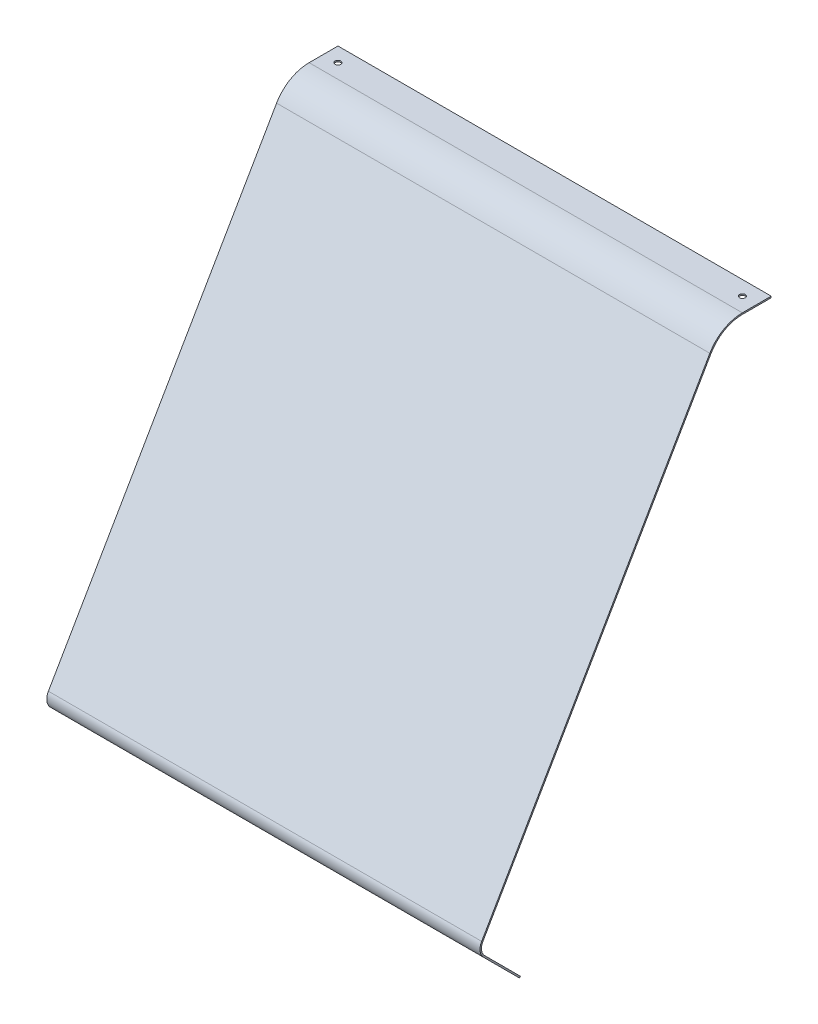
ISO-10303-21;
HEADER;
FILE_DESCRIPTION(('STEP AP214'),'2;1');
FILE_NAME('part.step','',(''),(''),'','','');
FILE_SCHEMA(('AUTOMOTIVE_DESIGN { 1 0 10303 214 1 1 1 1 }'));
ENDSEC;
DATA;
#1=APPLICATION_CONTEXT('core data for automotive mechanical design processes');
#2=APPLICATION_PROTOCOL_DEFINITION('international standard','automotive_design',2000,#1);
#3=PRODUCT_CONTEXT('',#1,'mechanical');
#4=PRODUCT('Part','Part','',(#3));
#5=PRODUCT_RELATED_PRODUCT_CATEGORY('part','',(#4));
#6=PRODUCT_DEFINITION_FORMATION('','',#4);
#7=PRODUCT_DEFINITION_CONTEXT('part definition',#1,'design');
#8=PRODUCT_DEFINITION('design','',#6,#7);
#9=PRODUCT_DEFINITION_SHAPE('','',#8);
#10=(LENGTH_UNIT() NAMED_UNIT(*) SI_UNIT(.MILLI.,.METRE.));
#11=(NAMED_UNIT(*) PLANE_ANGLE_UNIT() SI_UNIT($,.RADIAN.));
#12=(NAMED_UNIT(*) SI_UNIT($,.STERADIAN.) SOLID_ANGLE_UNIT());
#13=UNCERTAINTY_MEASURE_WITH_UNIT(LENGTH_MEASURE(1.E-05),#10,'distance_accuracy_value','');
#14=(GEOMETRIC_REPRESENTATION_CONTEXT(3) GLOBAL_UNCERTAINTY_ASSIGNED_CONTEXT((#13)) GLOBAL_UNIT_ASSIGNED_CONTEXT((#10,
#11,#12)) REPRESENTATION_CONTEXT('',''));
#15=CARTESIAN_POINT('',(0.,0.,0.));
#16=DIRECTION('',(0.,0.,1.));
#17=DIRECTION('',(1.,0.,0.));
#18=AXIS2_PLACEMENT_3D('',#15,#16,#17);
#19=CARTESIAN_POINT('',(0.,640.,-307.352147759817));
#20=DIRECTION('',(-1.,0.,0.));
#21=DIRECTION('',(0.,0.,-1.));
#22=AXIS2_PLACEMENT_3D('',#19,#20,#21);
#23=PLANE('',#22);
#24=DIRECTION('',(0.,0.,-1.));
#25=VECTOR('',#24,1.);
#26=CARTESIAN_POINT('',(0.,640.,-307.352147759817));
#27=LINE('',#26,#25);
#28=CARTESIAN_POINT('',(0.,640.,-307.352147759817));
#29=VERTEX_POINT('',#28);
#30=CARTESIAN_POINT('',(0.,640.,-347.352147759817));
#31=VERTEX_POINT('',#30);
#32=EDGE_CURVE('E208',#29,#31,#27,.T.);
#33=ORIENTED_EDGE('',*,*,#32,.F.);
#34=CARTESIAN_POINT('',(0.,590.,-307.352147759817));
#35=DIRECTION('',(-1.,0.,0.));
#36=DIRECTION('',(0.,0.,1.));
#37=AXIS2_PLACEMENT_3D('',#34,#35,#36);
#38=CIRCLE('',#37,50.0000000000003);
#39=CARTESIAN_POINT('',(0.,615.,-264.050877570594));
#40=VERTEX_POINT('',#39);
#41=EDGE_CURVE('E193',#40,#29,#38,.T.);
#42=ORIENTED_EDGE('',*,*,#41,.F.);
#43=DIRECTION('',(0.,0.86602540378444,-0.499999999999998));
#44=VECTOR('',#43,1.);
#45=CARTESIAN_POINT('',(0.,67.6719448082336,51.9491224294044));
#46=LINE('',#45,#44);
#47=CARTESIAN_POINT('',(0.,67.6719448082336,51.9491224294044));
#48=VERTEX_POINT('',#47);
#49=EDGE_CURVE('E181',#48,#40,#46,.T.);
#50=ORIENTED_EDGE('',*,*,#49,.F.);
#51=CARTESIAN_POINT('',(0.,60.1719448082336,38.9587413726378));
#52=DIRECTION('',(-1.,0.,0.));
#53=DIRECTION('',(0.,0.,-1.));
#54=AXIS2_PLACEMENT_3D('',#51,#52,#53);
#55=CIRCLE('',#54,15.);
#56=CARTESIAN_POINT('',(0.,49.5653430904353,49.5653430904359));
#57=VERTEX_POINT('',#56);
#58=EDGE_CURVE('E169',#57,#48,#55,.T.);
#59=ORIENTED_EDGE('',*,*,#58,.F.);
#60=DIRECTION('',(0.,0.707106781186543,0.707106781186552));
#61=VECTOR('',#60,1.);
#62=CARTESIAN_POINT('',(0.,0.,0.));
#63=LINE('',#62,#61);
#64=CARTESIAN_POINT('',(0.,0.,0.));
#65=VERTEX_POINT('',#64);
#66=EDGE_CURVE('E128',#65,#57,#63,.T.);
#67=ORIENTED_EDGE('',*,*,#66,.F.);
#68=DIRECTION('',(0.,0.707106781186552,-0.707106781186543));
#69=VECTOR('',#68,1.);
#70=CARTESIAN_POINT('',(0.,0.,0.));
#71=LINE('',#70,#69);
#72=CARTESIAN_POINT('',(0.,-1.4142135623731,1.41421356237309));
#73=VERTEX_POINT('',#72);
#74=EDGE_CURVE('E11',#73,#65,#71,.T.);
#75=ORIENTED_EDGE('',*,*,#74,.F.);
#76=DIRECTION('',(0.,0.707106781186543,0.707106781186552));
#77=VECTOR('',#76,1.);
#78=CARTESIAN_POINT('',(0.,-1.4142135623731,1.41421356237309));
#79=LINE('',#78,#77);
#80=CARTESIAN_POINT('',(0.,48.1511295280623,50.979556652809));
#81=VERTEX_POINT('',#80);
#82=EDGE_CURVE('E125',#73,#81,#79,.T.);
#83=ORIENTED_EDGE('',*,*,#82,.T.);
#84=CARTESIAN_POINT('',(0.,60.1719448082336,38.9587413726378));
#85=DIRECTION('',(1.,0.,0.));
#86=DIRECTION('',(0.,0.,-1.));
#87=AXIS2_PLACEMENT_3D('',#84,#85,#86);
#88=CIRCLE('',#87,17.);
#89=CARTESIAN_POINT('',(0.,68.6719448082336,53.6811732369732));
#90=VERTEX_POINT('',#89);
#91=EDGE_CURVE('E152',#81,#90,#88,.F.);
#92=ORIENTED_EDGE('',*,*,#91,.T.);
#93=DIRECTION('',(0.,0.86602540378444,-0.499999999999998));
#94=VECTOR('',#93,1.);
#95=CARTESIAN_POINT('',(0.,68.6719448082336,53.6811732369732));
#96=LINE('',#95,#94);
#97=CARTESIAN_POINT('',(0.,616.,-262.318826763026));
#98=VERTEX_POINT('',#97);
#99=EDGE_CURVE('E223',#90,#98,#96,.T.);
#100=ORIENTED_EDGE('',*,*,#99,.T.);
#101=CARTESIAN_POINT('',(0.,590.,-307.352147759817));
#102=DIRECTION('',(1.,0.,0.));
#103=DIRECTION('',(0.,0.,-1.));
#104=AXIS2_PLACEMENT_3D('',#101,#102,#103);
#105=CIRCLE('',#104,52.0000000000003);
#106=CARTESIAN_POINT('',(0.,642.,-307.352147759817));
#107=VERTEX_POINT('',#106);
#108=EDGE_CURVE('E228',#98,#107,#105,.F.);
#109=ORIENTED_EDGE('',*,*,#108,.T.);
#110=DIRECTION('',(0.,0.,-1.));
#111=VECTOR('',#110,1.);
#112=CARTESIAN_POINT('',(0.,642.,-307.352147759817));
#113=LINE('',#112,#111);
#114=CARTESIAN_POINT('',(0.,642.,-347.352147759817));
#115=VERTEX_POINT('',#114);
#116=EDGE_CURVE('E233',#107,#115,#113,.T.);
#117=ORIENTED_EDGE('',*,*,#116,.T.);
#118=DIRECTION('',(0.,-1.,0.));
#119=VECTOR('',#118,1.);
#120=CARTESIAN_POINT('',(0.,640.,-347.352147759817));
#121=LINE('',#120,#119);
#122=EDGE_CURVE('E57',#115,#31,#121,.T.);
#123=ORIENTED_EDGE('',*,*,#122,.T.);
#124=EDGE_LOOP('',(#33,#42,#50,#59,#67,#75,#83,#92,#100,#109,#117,#123));
#125=FACE_BOUND('',#124,.T.);
#126=ADVANCED_FACE('F46',(#125),#23,.T.);
#127=CARTESIAN_POINT('',(0.,640.,-347.352147759817));
#128=DIRECTION('',(0.,0.,-1.));
#129=DIRECTION('',(1.,0.,0.));
#130=AXIS2_PLACEMENT_3D('',#127,#128,#129);
#131=PLANE('',#130);
#132=ORIENTED_EDGE('',*,*,#122,.F.);
#133=DIRECTION('',(1.,0.,0.));
#134=VECTOR('',#133,1.);
#135=CARTESIAN_POINT('',(0.,642.,-347.352147759817));
#136=LINE('',#135,#134);
#137=CARTESIAN_POINT('',(600.,642.,-347.352147759817));
#138=VERTEX_POINT('',#137);
#139=EDGE_CURVE('E246',#115,#138,#136,.T.);
#140=ORIENTED_EDGE('',*,*,#139,.T.);
#141=DIRECTION('',(0.,-1.,0.));
#142=VECTOR('',#141,1.);
#143=CARTESIAN_POINT('',(600.,640.,-347.352147759817));
#144=LINE('',#143,#142);
#145=CARTESIAN_POINT('',(600.,640.,-347.352147759817));
#146=VERTEX_POINT('',#145);
#147=EDGE_CURVE('E155',#138,#146,#144,.T.);
#148=ORIENTED_EDGE('',*,*,#147,.T.);
#149=DIRECTION('',(1.,0.,0.));
#150=VECTOR('',#149,1.);
#151=CARTESIAN_POINT('',(0.,640.,-347.352147759817));
#152=LINE('',#151,#150);
#153=EDGE_CURVE('E204',#31,#146,#152,.T.);
#154=ORIENTED_EDGE('',*,*,#153,.F.);
#155=EDGE_LOOP('',(#132,#140,#148,#154));
#156=FACE_BOUND('',#155,.T.);
#157=ADVANCED_FACE('F274',(#156),#131,.T.);
#158=CARTESIAN_POINT('',(600.,0.,0.));
#159=DIRECTION('',(-1.,0.,0.));
#160=DIRECTION('',(0.,0.707106781186543,0.707106781186552));
#161=AXIS2_PLACEMENT_3D('',#158,#159,#160);
#162=PLANE('',#161);
#163=DIRECTION('',(0.,0.707106781186543,0.707106781186552));
#164=VECTOR('',#163,1.);
#165=CARTESIAN_POINT('',(600.,0.,0.));
#166=LINE('',#165,#164);
#167=CARTESIAN_POINT('',(600.,0.,0.));
#168=VERTEX_POINT('',#167);
#169=CARTESIAN_POINT('',(600.,49.5653430904353,49.5653430904359));
#170=VERTEX_POINT('',#169);
#171=EDGE_CURVE('E165',#168,#170,#166,.T.);
#172=ORIENTED_EDGE('',*,*,#171,.T.);
#173=CARTESIAN_POINT('',(600.,60.1719448082336,38.9587413726378));
#174=DIRECTION('',(-1.,0.,0.));
#175=DIRECTION('',(0.,0.,-1.));
#176=AXIS2_PLACEMENT_3D('',#173,#174,#175);
#177=CIRCLE('',#176,15.);
#178=CARTESIAN_POINT('',(600.,67.6719448082336,51.9491224294044));
#179=VERTEX_POINT('',#178);
#180=EDGE_CURVE('E177',#170,#179,#177,.T.);
#181=ORIENTED_EDGE('',*,*,#180,.T.);
#182=DIRECTION('',(0.,0.86602540378444,-0.499999999999998));
#183=VECTOR('',#182,1.);
#184=CARTESIAN_POINT('',(600.,67.6719448082336,51.9491224294044));
#185=LINE('',#184,#183);
#186=CARTESIAN_POINT('',(600.,615.,-264.050877570594));
#187=VERTEX_POINT('',#186);
#188=EDGE_CURVE('E189',#179,#187,#185,.T.);
#189=ORIENTED_EDGE('',*,*,#188,.T.);
#190=CARTESIAN_POINT('',(600.,590.,-307.352147759817));
#191=DIRECTION('',(-1.,0.,0.));
#192=DIRECTION('',(0.,0.,1.));
#193=AXIS2_PLACEMENT_3D('',#190,#191,#192);
#194=CIRCLE('',#193,50.0000000000003);
#195=CARTESIAN_POINT('',(600.,640.,-307.352147759817));
#196=VERTEX_POINT('',#195);
#197=EDGE_CURVE('E200',#187,#196,#194,.T.);
#198=ORIENTED_EDGE('',*,*,#197,.T.);
#199=DIRECTION('',(0.,0.,-1.));
#200=VECTOR('',#199,1.);
#201=CARTESIAN_POINT('',(600.,640.,-307.352147759817));
#202=LINE('',#201,#200);
#203=EDGE_CURVE('E145',#196,#146,#202,.T.);
#204=ORIENTED_EDGE('',*,*,#203,.T.);
#205=ORIENTED_EDGE('',*,*,#147,.F.);
#206=DIRECTION('',(0.,0.,-1.));
#207=VECTOR('',#206,1.);
#208=CARTESIAN_POINT('',(600.,642.,-307.352147759817));
#209=LINE('',#208,#207);
#210=CARTESIAN_POINT('',(600.,642.,-307.352147759817));
#211=VERTEX_POINT('',#210);
#212=EDGE_CURVE('E234',#211,#138,#209,.T.);
#213=ORIENTED_EDGE('',*,*,#212,.F.);
#214=CARTESIAN_POINT('',(600.,590.,-307.352147759817));
#215=DIRECTION('',(1.,0.,0.));
#216=DIRECTION('',(0.,0.,-1.));
#217=AXIS2_PLACEMENT_3D('',#214,#215,#216);
#218=CIRCLE('',#217,52.0000000000003);
#219=CARTESIAN_POINT('',(600.,616.,-262.318826763025));
#220=VERTEX_POINT('',#219);
#221=EDGE_CURVE('E229',#220,#211,#218,.F.);
#222=ORIENTED_EDGE('',*,*,#221,.F.);
#223=DIRECTION('',(0.,0.86602540378444,-0.499999999999998));
#224=VECTOR('',#223,1.);
#225=CARTESIAN_POINT('',(600.,68.6719448082336,53.6811732369732));
#226=LINE('',#225,#224);
#227=CARTESIAN_POINT('',(600.,68.6719448082336,53.6811732369732));
#228=VERTEX_POINT('',#227);
#229=EDGE_CURVE('E224',#228,#220,#226,.T.);
#230=ORIENTED_EDGE('',*,*,#229,.F.);
#231=CARTESIAN_POINT('',(600.,60.1719448082336,38.9587413726378));
#232=DIRECTION('',(1.,0.,0.));
#233=DIRECTION('',(0.,0.,-1.));
#234=AXIS2_PLACEMENT_3D('',#231,#232,#233);
#235=CIRCLE('',#234,17.);
#236=CARTESIAN_POINT('',(600.,48.1511295280622,50.979556652809));
#237=VERTEX_POINT('',#236);
#238=EDGE_CURVE('E219',#237,#228,#235,.F.);
#239=ORIENTED_EDGE('',*,*,#238,.F.);
#240=DIRECTION('',(0.,0.707106781186543,0.707106781186552));
#241=VECTOR('',#240,1.);
#242=CARTESIAN_POINT('',(600.,-1.4142135623731,1.41421356237309));
#243=LINE('',#242,#241);
#244=CARTESIAN_POINT('',(600.,-1.4142135623731,1.41421356237309));
#245=VERTEX_POINT('',#244);
#246=EDGE_CURVE('E139',#245,#237,#243,.T.);
#247=ORIENTED_EDGE('',*,*,#246,.F.);
#248=DIRECTION('',(0.,0.707106781186552,-0.707106781186543));
#249=VECTOR('',#248,1.);
#250=CARTESIAN_POINT('',(600.,0.,0.));
#251=LINE('',#250,#249);
#252=EDGE_CURVE('E50',#245,#168,#251,.T.);
#253=ORIENTED_EDGE('',*,*,#252,.T.);
#254=EDGE_LOOP('',(#172,#181,#189,#198,#204,#205,#213,#222,#230,#239,#247,#253));
#255=FACE_BOUND('',#254,.T.);
#256=ADVANCED_FACE('F279',(#255),#162,.F.);
#257=CARTESIAN_POINT('',(0.,0.,0.));
#258=DIRECTION('',(0.,0.707106781186543,0.707106781186552));
#259=DIRECTION('',(1.,0.,0.));
#260=AXIS2_PLACEMENT_3D('',#257,#258,#259);
#261=PLANE('',#260);
#262=DIRECTION('',(1.,0.,0.));
#263=VECTOR('',#262,1.);
#264=CARTESIAN_POINT('',(0.,-1.4142135623731,1.41421356237309));
#265=LINE('',#264,#263);
#266=EDGE_CURVE('E134',#73,#245,#265,.T.);
#267=ORIENTED_EDGE('',*,*,#266,.F.);
#268=ORIENTED_EDGE('',*,*,#74,.T.);
#269=DIRECTION('',(1.,0.,0.));
#270=VECTOR('',#269,1.);
#271=CARTESIAN_POINT('',(0.,0.,0.));
#272=LINE('',#271,#270);
#273=EDGE_CURVE('E162',#65,#168,#272,.T.);
#274=ORIENTED_EDGE('',*,*,#273,.T.);
#275=ORIENTED_EDGE('',*,*,#252,.F.);
#276=EDGE_LOOP('',(#267,#268,#274,#275));
#277=FACE_BOUND('',#276,.T.);
#278=ADVANCED_FACE('F48',(#277),#261,.F.);
#279=CARTESIAN_POINT('',(0.,0.,0.));
#280=DIRECTION('',(0.,0.707106781186552,-0.707106781186543));
#281=DIRECTION('',(0.,0.707106781186543,0.707106781186552));
#282=AXIS2_PLACEMENT_3D('',#279,#280,#281);
#283=PLANE('',#282);
#284=CARTESIAN_POINT('',(19.9999999999997,23.4023921865332,23.4023921865335));
#285=DIRECTION('',(0.,0.707106781186552,-0.707106781186543));
#286=DIRECTION('',(0.,0.707106781186543,0.707106781186552));
#287=AXIS2_PLACEMENT_3D('',#284,#285,#286);
#288=CIRCLE('',#287,3.99999999999999);
#289=CARTESIAN_POINT('',(19.9999999999997,26.2308193112794,26.2308193112797));
#290=VERTEX_POINT('',#289);
#291=EDGE_CURVE('E493',#290,#290,#288,.F.);
#292=ORIENTED_EDGE('',*,*,#291,.T.);
#293=EDGE_LOOP('',(#292));
#294=FACE_BOUND('',#293,.T.);
#295=CARTESIAN_POINT('',(580.,23.4023921865332,23.4023921865335));
#296=DIRECTION('',(0.,0.707106781186552,-0.707106781186543));
#297=DIRECTION('',(0.,0.707106781186543,0.707106781186552));
#298=AXIS2_PLACEMENT_3D('',#295,#296,#297);
#299=CIRCLE('',#298,3.99999999999999);
#300=CARTESIAN_POINT('',(580.,26.2308193112794,26.2308193112797));
#301=VERTEX_POINT('',#300);
#302=EDGE_CURVE('E250',#301,#301,#299,.F.);
#303=ORIENTED_EDGE('',*,*,#302,.T.);
#304=EDGE_LOOP('',(#303));
#305=FACE_BOUND('',#304,.T.);
#306=ORIENTED_EDGE('',*,*,#171,.F.);
#307=ORIENTED_EDGE('',*,*,#273,.F.);
#308=ORIENTED_EDGE('',*,*,#66,.T.);
#309=DIRECTION('',(1.,0.,0.));
#310=VECTOR('',#309,1.);
#311=CARTESIAN_POINT('',(0.,49.5653430904353,49.5653430904359));
#312=LINE('',#311,#310);
#313=EDGE_CURVE('E173',#57,#170,#312,.T.);
#314=ORIENTED_EDGE('',*,*,#313,.T.);
#315=EDGE_LOOP('',(#306,#307,#308,#314));
#316=FACE_BOUND('',#315,.T.);
#317=ADVANCED_FACE('F297',(#294,#305,#316),#283,.T.);
#318=CARTESIAN_POINT('',(0.,60.1719448082336,38.9587413726378));
#319=DIRECTION('',(1.,0.,0.));
#320=DIRECTION('',(0.,0.,-1.));
#321=AXIS2_PLACEMENT_3D('',#318,#319,#320);
#322=CYLINDRICAL_SURFACE('',#321,15.);
#323=ORIENTED_EDGE('',*,*,#180,.F.);
#324=ORIENTED_EDGE('',*,*,#313,.F.);
#325=ORIENTED_EDGE('',*,*,#58,.T.);
#326=DIRECTION('',(1.,0.,0.));
#327=VECTOR('',#326,1.);
#328=CARTESIAN_POINT('',(0.,67.6719448082336,51.9491224294044));
#329=LINE('',#328,#327);
#330=EDGE_CURVE('E185',#48,#179,#329,.T.);
#331=ORIENTED_EDGE('',*,*,#330,.T.);
#332=EDGE_LOOP('',(#323,#324,#325,#331));
#333=FACE_BOUND('',#332,.T.);
#334=ADVANCED_FACE('F294',(#333),#322,.F.);
#335=CARTESIAN_POINT('',(0.,67.6719448082336,51.9491224294044));
#336=DIRECTION('',(0.,-0.499999999999998,-0.86602540378444));
#337=DIRECTION('',(0.,0.86602540378444,-0.499999999999998));
#338=AXIS2_PLACEMENT_3D('',#335,#336,#337);
#339=PLANE('',#338);
#340=ORIENTED_EDGE('',*,*,#188,.F.);
#341=ORIENTED_EDGE('',*,*,#330,.F.);
#342=ORIENTED_EDGE('',*,*,#49,.T.);
#343=DIRECTION('',(1.,0.,0.));
#344=VECTOR('',#343,1.);
#345=CARTESIAN_POINT('',(0.,615.,-264.050877570594));
#346=LINE('',#345,#344);
#347=EDGE_CURVE('E196',#40,#187,#346,.T.);
#348=ORIENTED_EDGE('',*,*,#347,.T.);
#349=EDGE_LOOP('',(#340,#341,#342,#348));
#350=FACE_BOUND('',#349,.T.);
#351=ADVANCED_FACE('F285',(#350),#339,.T.);
#352=CARTESIAN_POINT('',(0.,590.,-307.352147759817));
#353=DIRECTION('',(1.,0.,0.));
#354=DIRECTION('',(0.,0.,-1.));
#355=AXIS2_PLACEMENT_3D('',#352,#353,#354);
#356=CYLINDRICAL_SURFACE('',#355,50.0000000000003);
#357=ORIENTED_EDGE('',*,*,#197,.F.);
#358=ORIENTED_EDGE('',*,*,#347,.F.);
#359=ORIENTED_EDGE('',*,*,#41,.T.);
#360=DIRECTION('',(1.,0.,0.));
#361=VECTOR('',#360,1.);
#362=CARTESIAN_POINT('',(0.,640.,-307.352147759817));
#363=LINE('',#362,#361);
#364=EDGE_CURVE('E149',#29,#196,#363,.T.);
#365=ORIENTED_EDGE('',*,*,#364,.T.);
#366=EDGE_LOOP('',(#357,#358,#359,#365));
#367=FACE_BOUND('',#366,.T.);
#368=ADVANCED_FACE('F281',(#367),#356,.F.);
#369=CARTESIAN_POINT('',(0.,640.,-307.352147759817));
#370=DIRECTION('',(0.,-1.,0.));
#371=DIRECTION('',(0.,0.,-1.));
#372=AXIS2_PLACEMENT_3D('',#369,#370,#371);
#373=PLANE('',#372);
#374=CARTESIAN_POINT('',(19.9999999999997,640.,-327.352147759817));
#375=DIRECTION('',(0.,-1.,0.));
#376=DIRECTION('',(0.,0.,-1.));
#377=AXIS2_PLACEMENT_3D('',#374,#375,#376);
#378=CIRCLE('',#377,3.99999999999999);
#379=CARTESIAN_POINT('',(19.9999999999997,640.,-331.352147759817));
#380=VERTEX_POINT('',#379);
#381=EDGE_CURVE('E486',#380,#380,#378,.F.);
#382=ORIENTED_EDGE('',*,*,#381,.T.);
#383=EDGE_LOOP('',(#382));
#384=FACE_BOUND('',#383,.T.);
#385=CARTESIAN_POINT('',(580.,640.,-327.352147759817));
#386=DIRECTION('',(0.,-1.,0.));
#387=DIRECTION('',(0.,0.,-1.));
#388=AXIS2_PLACEMENT_3D('',#385,#386,#387);
#389=CIRCLE('',#388,3.99999999999999);
#390=CARTESIAN_POINT('',(580.,640.,-331.352147759817));
#391=VERTEX_POINT('',#390);
#392=EDGE_CURVE('E504',#391,#391,#389,.F.);
#393=ORIENTED_EDGE('',*,*,#392,.T.);
#394=EDGE_LOOP('',(#393));
#395=FACE_BOUND('',#394,.T.);
#396=ORIENTED_EDGE('',*,*,#203,.F.);
#397=ORIENTED_EDGE('',*,*,#364,.F.);
#398=ORIENTED_EDGE('',*,*,#32,.T.);
#399=ORIENTED_EDGE('',*,*,#153,.T.);
#400=EDGE_LOOP('',(#396,#397,#398,#399));
#401=FACE_BOUND('',#400,.T.);
#402=ADVANCED_FACE('F277',(#384,#395,#401),#373,.T.);
#403=CARTESIAN_POINT('',(0.,-1.4142135623731,1.41421356237309));
#404=DIRECTION('',(0.,0.707106781186552,-0.707106781186543));
#405=DIRECTION('',(0.,0.707106781186543,0.707106781186552));
#406=AXIS2_PLACEMENT_3D('',#403,#404,#405);
#407=PLANE('',#406);
#408=CARTESIAN_POINT('',(19.9999999999997,21.9881786241601,24.8166057489066));
#409=DIRECTION('',(0.,-0.707106781186552,0.707106781186543));
#410=DIRECTION('',(0.,-0.707106781186543,-0.707106781186552));
#411=AXIS2_PLACEMENT_3D('',#408,#409,#410);
#412=CIRCLE('',#411,3.99999999999999);
#413=CARTESIAN_POINT('',(19.9999999999997,19.159751499414,21.9881786241604));
#414=VERTEX_POINT('',#413);
#415=EDGE_CURVE('E488',#414,#414,#412,.T.);
#416=ORIENTED_EDGE('',*,*,#415,.F.);
#417=EDGE_LOOP('',(#416));
#418=FACE_BOUND('',#417,.T.);
#419=CARTESIAN_POINT('',(580.,21.9881786241601,24.8166057489066));
#420=DIRECTION('',(0.,-0.707106781186552,0.707106781186543));
#421=DIRECTION('',(0.,-0.707106781186543,-0.707106781186552));
#422=AXIS2_PLACEMENT_3D('',#419,#420,#421);
#423=CIRCLE('',#422,3.99999999999999);
#424=CARTESIAN_POINT('',(580.,19.159751499414,21.9881786241604));
#425=VERTEX_POINT('',#424);
#426=EDGE_CURVE('E508',#425,#425,#423,.T.);
#427=ORIENTED_EDGE('',*,*,#426,.F.);
#428=EDGE_LOOP('',(#427));
#429=FACE_BOUND('',#428,.T.);
#430=ORIENTED_EDGE('',*,*,#246,.T.);
#431=DIRECTION('',(1.,0.,0.));
#432=VECTOR('',#431,1.);
#433=CARTESIAN_POINT('',(0.,48.1511295280622,50.979556652809));
#434=LINE('',#433,#432);
#435=EDGE_CURVE('E142',#81,#237,#434,.T.);
#436=ORIENTED_EDGE('',*,*,#435,.F.);
#437=ORIENTED_EDGE('',*,*,#82,.F.);
#438=ORIENTED_EDGE('',*,*,#266,.T.);
#439=EDGE_LOOP('',(#430,#436,#437,#438));
#440=FACE_BOUND('',#439,.T.);
#441=ADVANCED_FACE('F141',(#418,#429,#440),#407,.F.);
#442=CARTESIAN_POINT('',(0.,60.1719448082336,38.9587413726378));
#443=DIRECTION('',(1.,0.,0.));
#444=DIRECTION('',(0.,0.,-1.));
#445=AXIS2_PLACEMENT_3D('',#442,#443,#444);
#446=CYLINDRICAL_SURFACE('',#445,17.);
#447=ORIENTED_EDGE('',*,*,#238,.T.);
#448=DIRECTION('',(1.,0.,0.));
#449=VECTOR('',#448,1.);
#450=CARTESIAN_POINT('',(0.,68.6719448082336,53.6811732369732));
#451=LINE('',#450,#449);
#452=EDGE_CURVE('E220',#90,#228,#451,.T.);
#453=ORIENTED_EDGE('',*,*,#452,.F.);
#454=ORIENTED_EDGE('',*,*,#91,.F.);
#455=ORIENTED_EDGE('',*,*,#435,.T.);
#456=EDGE_LOOP('',(#447,#453,#454,#455));
#457=FACE_BOUND('',#456,.T.);
#458=ADVANCED_FACE('F300',(#457),#446,.T.);
#459=CARTESIAN_POINT('',(0.,68.6719448082336,53.6811732369732));
#460=DIRECTION('',(0.,-0.499999999999998,-0.86602540378444));
#461=DIRECTION('',(0.,0.86602540378444,-0.499999999999998));
#462=AXIS2_PLACEMENT_3D('',#459,#460,#461);
#463=PLANE('',#462);
#464=ORIENTED_EDGE('',*,*,#229,.T.);
#465=DIRECTION('',(1.,0.,0.));
#466=VECTOR('',#465,1.);
#467=CARTESIAN_POINT('',(0.,616.,-262.318826763025));
#468=LINE('',#467,#466);
#469=EDGE_CURVE('E225',#98,#220,#468,.T.);
#470=ORIENTED_EDGE('',*,*,#469,.F.);
#471=ORIENTED_EDGE('',*,*,#99,.F.);
#472=ORIENTED_EDGE('',*,*,#452,.T.);
#473=EDGE_LOOP('',(#464,#470,#471,#472));
#474=FACE_BOUND('',#473,.T.);
#475=ADVANCED_FACE('F263',(#474),#463,.F.);
#476=CARTESIAN_POINT('',(0.,590.,-307.352147759817));
#477=DIRECTION('',(1.,0.,0.));
#478=DIRECTION('',(0.,0.,-1.));
#479=AXIS2_PLACEMENT_3D('',#476,#477,#478);
#480=CYLINDRICAL_SURFACE('',#479,52.0000000000003);
#481=ORIENTED_EDGE('',*,*,#221,.T.);
#482=DIRECTION('',(1.,0.,0.));
#483=VECTOR('',#482,1.);
#484=CARTESIAN_POINT('',(0.,642.,-307.352147759817));
#485=LINE('',#484,#483);
#486=EDGE_CURVE('E230',#107,#211,#485,.T.);
#487=ORIENTED_EDGE('',*,*,#486,.F.);
#488=ORIENTED_EDGE('',*,*,#108,.F.);
#489=ORIENTED_EDGE('',*,*,#469,.T.);
#490=EDGE_LOOP('',(#481,#487,#488,#489));
#491=FACE_BOUND('',#490,.T.);
#492=ADVANCED_FACE('F267',(#491),#480,.T.);
#493=CARTESIAN_POINT('',(0.,642.,-307.352147759817));
#494=DIRECTION('',(0.,-1.,0.));
#495=DIRECTION('',(0.,0.,-1.));
#496=AXIS2_PLACEMENT_3D('',#493,#494,#495);
#497=PLANE('',#496);
#498=CARTESIAN_POINT('',(19.9999999999997,642.,-327.352147759817));
#499=DIRECTION('',(0.,1.,0.));
#500=DIRECTION('',(0.,0.,1.));
#501=AXIS2_PLACEMENT_3D('',#498,#499,#500);
#502=CIRCLE('',#501,3.99999999999999);
#503=CARTESIAN_POINT('',(19.9999999999997,642.,-323.352147759817));
#504=VERTEX_POINT('',#503);
#505=EDGE_CURVE('E483',#504,#504,#502,.T.);
#506=ORIENTED_EDGE('',*,*,#505,.F.);
#507=EDGE_LOOP('',(#506));
#508=FACE_BOUND('',#507,.T.);
#509=CARTESIAN_POINT('',(580.,642.,-327.352147759817));
#510=DIRECTION('',(0.,1.,0.));
#511=DIRECTION('',(0.,0.,1.));
#512=AXIS2_PLACEMENT_3D('',#509,#510,#511);
#513=CIRCLE('',#512,3.99999999999999);
#514=CARTESIAN_POINT('',(580.,642.,-323.352147759817));
#515=VERTEX_POINT('',#514);
#516=EDGE_CURVE('E500',#515,#515,#513,.T.);
#517=ORIENTED_EDGE('',*,*,#516,.F.);
#518=EDGE_LOOP('',(#517));
#519=FACE_BOUND('',#518,.T.);
#520=ORIENTED_EDGE('',*,*,#212,.T.);
#521=ORIENTED_EDGE('',*,*,#139,.F.);
#522=ORIENTED_EDGE('',*,*,#116,.F.);
#523=ORIENTED_EDGE('',*,*,#486,.T.);
#524=EDGE_LOOP('',(#520,#521,#522,#523));
#525=FACE_BOUND('',#524,.T.);
#526=ADVANCED_FACE('F272',(#508,#519,#525),#497,.F.);
#527=CARTESIAN_POINT('',(580.,31.4023921865333,15.4023921865336));
#528=DIRECTION('',(0.,-0.707106781186552,0.707106781186543));
#529=DIRECTION('',(0.,-0.707106781186543,-0.707106781186552));
#530=AXIS2_PLACEMENT_3D('',#527,#528,#529);
#531=CYLINDRICAL_SURFACE('',#530,3.99999999999999);
#532=ORIENTED_EDGE('',*,*,#426,.T.);
#533=EDGE_LOOP('',(#532));
#534=FACE_BOUND('',#533,.T.);
#535=ORIENTED_EDGE('',*,*,#302,.F.);
#536=EDGE_LOOP('',(#535));
#537=FACE_BOUND('',#536,.T.);
#538=ADVANCED_FACE('F323',(#534,#537),#531,.F.);
#539=CARTESIAN_POINT('',(580.,628.686291501015,-327.352147759817));
#540=DIRECTION('',(0.,1.,0.));
#541=DIRECTION('',(0.,0.,1.));
#542=AXIS2_PLACEMENT_3D('',#539,#540,#541);
#543=CYLINDRICAL_SURFACE('',#542,3.99999999999999);
#544=ORIENTED_EDGE('',*,*,#516,.T.);
#545=EDGE_LOOP('',(#544));
#546=FACE_BOUND('',#545,.T.);
#547=ORIENTED_EDGE('',*,*,#392,.F.);
#548=EDGE_LOOP('',(#547));
#549=FACE_BOUND('',#548,.T.);
#550=ADVANCED_FACE('F338',(#546,#549),#543,.F.);
#551=CARTESIAN_POINT('',(19.9999999999997,31.4023921865333,15.4023921865336));
#552=DIRECTION('',(0.,-0.707106781186552,0.707106781186543));
#553=DIRECTION('',(0.,-0.707106781186543,-0.707106781186552));
#554=AXIS2_PLACEMENT_3D('',#551,#552,#553);
#555=CYLINDRICAL_SURFACE('',#554,3.99999999999999);
#556=ORIENTED_EDGE('',*,*,#415,.T.);
#557=EDGE_LOOP('',(#556));
#558=FACE_BOUND('',#557,.T.);
#559=ORIENTED_EDGE('',*,*,#291,.F.);
#560=EDGE_LOOP('',(#559));
#561=FACE_BOUND('',#560,.T.);
#562=ADVANCED_FACE('F347',(#558,#561),#555,.F.);
#563=CARTESIAN_POINT('',(19.9999999999997,628.686291501015,-327.352147759817));
#564=DIRECTION('',(0.,1.,0.));
#565=DIRECTION('',(0.,0.,1.));
#566=AXIS2_PLACEMENT_3D('',#563,#564,#565);
#567=CYLINDRICAL_SURFACE('',#566,3.99999999999999);
#568=ORIENTED_EDGE('',*,*,#505,.T.);
#569=EDGE_LOOP('',(#568));
#570=FACE_BOUND('',#569,.T.);
#571=ORIENTED_EDGE('',*,*,#381,.F.);
#572=EDGE_LOOP('',(#571));
#573=FACE_BOUND('',#572,.T.);
#574=ADVANCED_FACE('F384',(#570,#573),#567,.F.);
#575=CLOSED_SHELL('',(#126,#157,#256,#278,#317,#334,#351,#368,#402,#441,#458,#475,#492,#526,
#538,#550,#562,#574));
#576=MANIFOLD_SOLID_BREP('B2',#575);
#577=ADVANCED_BREP_SHAPE_REPRESENTATION('',(#18,#576),#14);
#578=SHAPE_DEFINITION_REPRESENTATION(#9,#577);
ENDSEC;
END-ISO-10303-21;
